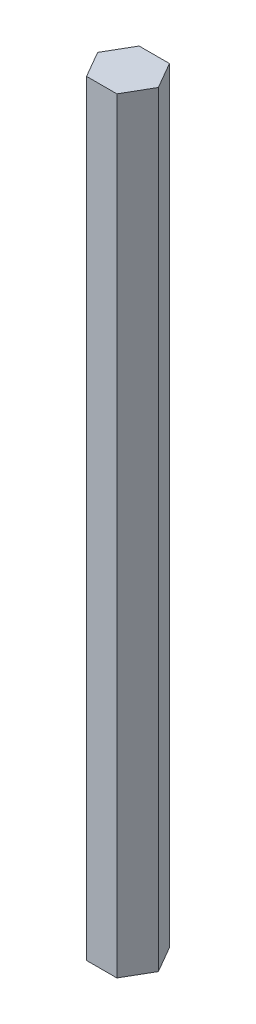
ISO-10303-21;
HEADER;
FILE_DESCRIPTION(('STEP AP214'),'2;1');
FILE_NAME('part.step','',(''),(''),'','','');
FILE_SCHEMA(('AUTOMOTIVE_DESIGN { 1 0 10303 214 1 1 1 1 }'));
ENDSEC;
DATA;
#1=APPLICATION_CONTEXT('core data for automotive mechanical design processes');
#2=APPLICATION_PROTOCOL_DEFINITION('international standard','automotive_design',2000,#1);
#3=PRODUCT_CONTEXT('',#1,'mechanical');
#4=PRODUCT('Part','Part','',(#3));
#5=PRODUCT_RELATED_PRODUCT_CATEGORY('part','',(#4));
#6=PRODUCT_DEFINITION_FORMATION('','',#4);
#7=PRODUCT_DEFINITION_CONTEXT('part definition',#1,'design');
#8=PRODUCT_DEFINITION('design','',#6,#7);
#9=PRODUCT_DEFINITION_SHAPE('','',#8);
#10=(LENGTH_UNIT() NAMED_UNIT(*) SI_UNIT(.MILLI.,.METRE.));
#11=(NAMED_UNIT(*) PLANE_ANGLE_UNIT() SI_UNIT($,.RADIAN.));
#12=(NAMED_UNIT(*) SI_UNIT($,.STERADIAN.) SOLID_ANGLE_UNIT());
#13=UNCERTAINTY_MEASURE_WITH_UNIT(LENGTH_MEASURE(1.E-05),#10,'distance_accuracy_value','');
#14=(GEOMETRIC_REPRESENTATION_CONTEXT(3) GLOBAL_UNCERTAINTY_ASSIGNED_CONTEXT((#13)) GLOBAL_UNIT_ASSIGNED_CONTEXT((#10,
#11,#12)) REPRESENTATION_CONTEXT('',''));
#15=CARTESIAN_POINT('',(0.,0.,0.));
#16=DIRECTION('',(0.,0.,1.));
#17=DIRECTION('',(1.,0.,0.));
#18=AXIS2_PLACEMENT_3D('',#15,#16,#17);
#19=CARTESIAN_POINT('',(3.66617420935419,185.,6.34999999999995));
#20=DIRECTION('',(-0.866025403784441,0.,-0.499999999999995));
#21=DIRECTION('',(-0.499999999999995,0.,0.866025403784441));
#22=AXIS2_PLACEMENT_3D('',#19,#20,#21);
#23=PLANE('',#22);
#24=DIRECTION('',(0.499999999999995,0.,-0.866025403784441));
#25=VECTOR('',#24,1.);
#26=CARTESIAN_POINT('',(3.66617420935419,0.,6.34999999999995));
#27=LINE('',#26,#25);
#28=CARTESIAN_POINT('',(3.66617420935419,0.,6.34999999999995));
#29=VERTEX_POINT('',#28);
#30=CARTESIAN_POINT('',(7.33234841870824,0.,0.));
#31=VERTEX_POINT('',#30);
#32=EDGE_CURVE('E128',#29,#31,#27,.T.);
#33=ORIENTED_EDGE('',*,*,#32,.T.);
#34=DIRECTION('',(0.,-1.,0.));
#35=VECTOR('',#34,1.);
#36=CARTESIAN_POINT('',(7.33234841870824,185.,0.));
#37=LINE('',#36,#35);
#38=CARTESIAN_POINT('',(7.33234841870824,185.,0.));
#39=VERTEX_POINT('',#38);
#40=EDGE_CURVE('E11',#39,#31,#37,.T.);
#41=ORIENTED_EDGE('',*,*,#40,.F.);
#42=DIRECTION('',(0.499999999999995,0.,-0.866025403784441));
#43=VECTOR('',#42,1.);
#44=CARTESIAN_POINT('',(3.66617420935419,185.,6.34999999999995));
#45=LINE('',#44,#43);
#46=CARTESIAN_POINT('',(3.66617420935419,185.,6.34999999999995));
#47=VERTEX_POINT('',#46);
#48=EDGE_CURVE('E144',#47,#39,#45,.T.);
#49=ORIENTED_EDGE('',*,*,#48,.F.);
#50=DIRECTION('',(0.,-1.,0.));
#51=VECTOR('',#50,1.);
#52=CARTESIAN_POINT('',(3.66617420935419,185.,6.34999999999995));
#53=LINE('',#52,#51);
#54=EDGE_CURVE('E124',#47,#29,#53,.T.);
#55=ORIENTED_EDGE('',*,*,#54,.T.);
#56=EDGE_LOOP('',(#33,#41,#49,#55));
#57=FACE_BOUND('',#56,.T.);
#58=ADVANCED_FACE('F39',(#57),#23,.F.);
#59=CARTESIAN_POINT('',(7.33234841870824,185.,0.));
#60=DIRECTION('',(-0.866025403784438,0.,0.500000000000001));
#61=DIRECTION('',(0.500000000000001,0.,0.866025403784438));
#62=AXIS2_PLACEMENT_3D('',#59,#60,#61);
#63=PLANE('',#62);
#64=DIRECTION('',(-0.500000000000001,0.,-0.866025403784438));
#65=VECTOR('',#64,1.);
#66=CARTESIAN_POINT('',(7.33234841870824,0.,0.));
#67=LINE('',#66,#65);
#68=CARTESIAN_POINT('',(3.6661742093541,0.,-6.35));
#69=VERTEX_POINT('',#68);
#70=EDGE_CURVE('E132',#31,#69,#67,.T.);
#71=ORIENTED_EDGE('',*,*,#70,.T.);
#72=DIRECTION('',(0.,-1.,0.));
#73=VECTOR('',#72,1.);
#74=CARTESIAN_POINT('',(3.6661742093541,185.,-6.35));
#75=LINE('',#74,#73);
#76=CARTESIAN_POINT('',(3.6661742093541,185.,-6.35));
#77=VERTEX_POINT('',#76);
#78=EDGE_CURVE('E48',#77,#69,#75,.T.);
#79=ORIENTED_EDGE('',*,*,#78,.F.);
#80=DIRECTION('',(-0.500000000000001,0.,-0.866025403784438));
#81=VECTOR('',#80,1.);
#82=CARTESIAN_POINT('',(7.33234841870824,185.,0.));
#83=LINE('',#82,#81);
#84=EDGE_CURVE('E93',#39,#77,#83,.T.);
#85=ORIENTED_EDGE('',*,*,#84,.F.);
#86=ORIENTED_EDGE('',*,*,#40,.T.);
#87=EDGE_LOOP('',(#71,#79,#85,#86));
#88=FACE_BOUND('',#87,.T.);
#89=ADVANCED_FACE('F172',(#88),#63,.F.);
#90=CARTESIAN_POINT('',(3.6661742093541,185.,-6.35));
#91=DIRECTION('',(0.,0.,1.));
#92=DIRECTION('',(1.,0.,0.));
#93=AXIS2_PLACEMENT_3D('',#90,#91,#92);
#94=PLANE('',#93);
#95=DIRECTION('',(-1.,0.,0.));
#96=VECTOR('',#95,1.);
#97=CARTESIAN_POINT('',(3.6661742093541,0.,-6.35));
#98=LINE('',#97,#96);
#99=CARTESIAN_POINT('',(-3.66617420935415,0.,-6.34999999999997));
#100=VERTEX_POINT('',#99);
#101=EDGE_CURVE('E135',#69,#100,#98,.T.);
#102=ORIENTED_EDGE('',*,*,#101,.T.);
#103=DIRECTION('',(0.,-1.,0.));
#104=VECTOR('',#103,1.);
#105=CARTESIAN_POINT('',(-3.66617420935415,185.,-6.34999999999997));
#106=LINE('',#105,#104);
#107=CARTESIAN_POINT('',(-3.66617420935415,185.,-6.34999999999997));
#108=VERTEX_POINT('',#107);
#109=EDGE_CURVE('E117',#108,#100,#106,.T.);
#110=ORIENTED_EDGE('',*,*,#109,.F.);
#111=DIRECTION('',(-1.,0.,0.));
#112=VECTOR('',#111,1.);
#113=CARTESIAN_POINT('',(3.6661742093541,185.,-6.35));
#114=LINE('',#113,#112);
#115=EDGE_CURVE('E106',#77,#108,#114,.T.);
#116=ORIENTED_EDGE('',*,*,#115,.F.);
#117=ORIENTED_EDGE('',*,*,#78,.T.);
#118=EDGE_LOOP('',(#102,#110,#116,#117));
#119=FACE_BOUND('',#118,.T.);
#120=ADVANCED_FACE('F154',(#119),#94,.F.);
#121=CARTESIAN_POINT('',(-3.66617420935415,185.,-6.34999999999997));
#122=DIRECTION('',(0.866025403784442,0.,0.499999999999995));
#123=DIRECTION('',(0.499999999999995,0.,-0.866025403784442));
#124=AXIS2_PLACEMENT_3D('',#121,#122,#123);
#125=PLANE('',#124);
#126=DIRECTION('',(-0.499999999999995,0.,0.866025403784442));
#127=VECTOR('',#126,1.);
#128=CARTESIAN_POINT('',(-3.66617420935415,0.,-6.34999999999997));
#129=LINE('',#128,#127);
#130=CARTESIAN_POINT('',(-7.33234841870824,0.,0.));
#131=VERTEX_POINT('',#130);
#132=EDGE_CURVE('E115',#100,#131,#129,.T.);
#133=ORIENTED_EDGE('',*,*,#132,.T.);
#134=DIRECTION('',(0.,-1.,0.));
#135=VECTOR('',#134,1.);
#136=CARTESIAN_POINT('',(-7.33234841870824,185.,0.));
#137=LINE('',#136,#135);
#138=CARTESIAN_POINT('',(-7.33234841870824,185.,0.));
#139=VERTEX_POINT('',#138);
#140=EDGE_CURVE('E112',#139,#131,#137,.T.);
#141=ORIENTED_EDGE('',*,*,#140,.F.);
#142=DIRECTION('',(-0.499999999999995,0.,0.866025403784442));
#143=VECTOR('',#142,1.);
#144=CARTESIAN_POINT('',(-3.66617420935415,185.,-6.34999999999997));
#145=LINE('',#144,#143);
#146=EDGE_CURVE('E100',#108,#139,#145,.T.);
#147=ORIENTED_EDGE('',*,*,#146,.F.);
#148=ORIENTED_EDGE('',*,*,#109,.T.);
#149=EDGE_LOOP('',(#133,#141,#147,#148));
#150=FACE_BOUND('',#149,.T.);
#151=ADVANCED_FACE('F113',(#150),#125,.F.);
#152=CARTESIAN_POINT('',(-7.33234841870824,185.,0.));
#153=DIRECTION('',(0.866025403784434,0.,-0.500000000000007));
#154=DIRECTION('',(-0.500000000000007,0.,-0.866025403784435));
#155=AXIS2_PLACEMENT_3D('',#152,#153,#154);
#156=PLANE('',#155);
#157=DIRECTION('',(0.500000000000007,0.,0.866025403784435));
#158=VECTOR('',#157,1.);
#159=CARTESIAN_POINT('',(-7.33234841870824,0.,0.));
#160=LINE('',#159,#158);
#161=CARTESIAN_POINT('',(-3.66617420935406,0.,6.35000000000002));
#162=VERTEX_POINT('',#161);
#163=EDGE_CURVE('E79',#131,#162,#160,.T.);
#164=ORIENTED_EDGE('',*,*,#163,.T.);
#165=DIRECTION('',(0.,-1.,0.));
#166=VECTOR('',#165,1.);
#167=CARTESIAN_POINT('',(-3.66617420935406,185.,6.35000000000002));
#168=LINE('',#167,#166);
#169=CARTESIAN_POINT('',(-3.66617420935406,185.,6.35000000000002));
#170=VERTEX_POINT('',#169);
#171=EDGE_CURVE('E118',#170,#162,#168,.T.);
#172=ORIENTED_EDGE('',*,*,#171,.F.);
#173=DIRECTION('',(0.500000000000007,0.,0.866025403784435));
#174=VECTOR('',#173,1.);
#175=CARTESIAN_POINT('',(-7.33234841870824,185.,0.));
#176=LINE('',#175,#174);
#177=EDGE_CURVE('E104',#139,#170,#176,.T.);
#178=ORIENTED_EDGE('',*,*,#177,.F.);
#179=ORIENTED_EDGE('',*,*,#140,.T.);
#180=EDGE_LOOP('',(#164,#172,#178,#179));
#181=FACE_BOUND('',#180,.T.);
#182=ADVANCED_FACE('F120',(#181),#156,.F.);
#183=CARTESIAN_POINT('',(-3.66617420935406,185.,6.35000000000002));
#184=DIRECTION('',(0.,0.,-1.));
#185=DIRECTION('',(-1.,0.,0.));
#186=AXIS2_PLACEMENT_3D('',#183,#184,#185);
#187=PLANE('',#186);
#188=DIRECTION('',(1.,0.,0.));
#189=VECTOR('',#188,1.);
#190=CARTESIAN_POINT('',(-3.66617420935406,0.,6.35000000000002));
#191=LINE('',#190,#189);
#192=EDGE_CURVE('E85',#162,#29,#191,.T.);
#193=ORIENTED_EDGE('',*,*,#192,.T.);
#194=ORIENTED_EDGE('',*,*,#54,.F.);
#195=DIRECTION('',(1.,0.,0.));
#196=VECTOR('',#195,1.);
#197=CARTESIAN_POINT('',(-3.66617420935406,185.,6.35000000000002));
#198=LINE('',#197,#196);
#199=EDGE_CURVE('E56',#170,#47,#198,.T.);
#200=ORIENTED_EDGE('',*,*,#199,.F.);
#201=ORIENTED_EDGE('',*,*,#171,.T.);
#202=EDGE_LOOP('',(#193,#194,#200,#201));
#203=FACE_BOUND('',#202,.T.);
#204=ADVANCED_FACE('F161',(#203),#187,.F.);
#205=CARTESIAN_POINT('',(0.,185.,0.));
#206=DIRECTION('',(0.,1.,0.));
#207=DIRECTION('',(0.,0.,1.));
#208=AXIS2_PLACEMENT_3D('',#205,#206,#207);
#209=PLANE('',#208);
#210=ORIENTED_EDGE('',*,*,#48,.T.);
#211=ORIENTED_EDGE('',*,*,#84,.T.);
#212=ORIENTED_EDGE('',*,*,#115,.T.);
#213=ORIENTED_EDGE('',*,*,#146,.T.);
#214=ORIENTED_EDGE('',*,*,#177,.T.);
#215=ORIENTED_EDGE('',*,*,#199,.T.);
#216=EDGE_LOOP('',(#210,#211,#212,#213,#214,#215));
#217=FACE_BOUND('',#216,.T.);
#218=ADVANCED_FACE('F102',(#217),#209,.T.);
#219=CARTESIAN_POINT('',(0.,0.,0.));
#220=DIRECTION('',(0.,1.,0.));
#221=DIRECTION('',(0.,0.,1.));
#222=AXIS2_PLACEMENT_3D('',#219,#220,#221);
#223=PLANE('',#222);
#224=ORIENTED_EDGE('',*,*,#32,.F.);
#225=ORIENTED_EDGE('',*,*,#192,.F.);
#226=ORIENTED_EDGE('',*,*,#163,.F.);
#227=ORIENTED_EDGE('',*,*,#132,.F.);
#228=ORIENTED_EDGE('',*,*,#101,.F.);
#229=ORIENTED_EDGE('',*,*,#70,.F.);
#230=EDGE_LOOP('',(#224,#225,#226,#227,#228,#229));
#231=FACE_BOUND('',#230,.T.);
#232=ADVANCED_FACE('F157',(#231),#223,.F.);
#233=CLOSED_SHELL('',(#58,#89,#120,#151,#182,#204,#218,#232));
#234=MANIFOLD_SOLID_BREP('B2',#233);
#235=ADVANCED_BREP_SHAPE_REPRESENTATION('',(#18,#234),#14);
#236=SHAPE_DEFINITION_REPRESENTATION(#9,#235);
ENDSEC;
END-ISO-10303-21;
